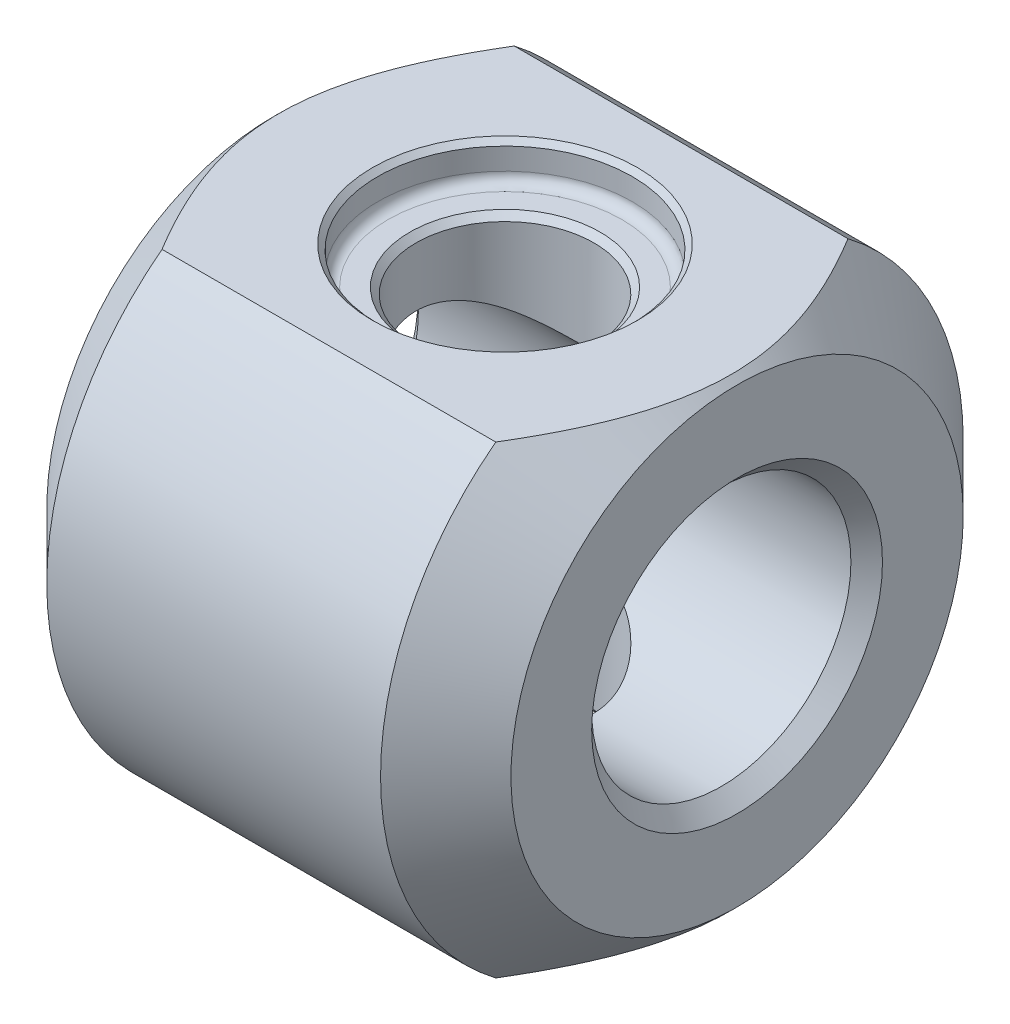
ISO-10303-21;
HEADER;
FILE_DESCRIPTION(('STEP AP214'),'2;1');
FILE_NAME('part.step','',(''),(''),'','','');
FILE_SCHEMA(('AUTOMOTIVE_DESIGN { 1 0 10303 214 1 1 1 1 }'));
ENDSEC;
DATA;
#1=APPLICATION_CONTEXT('core data for automotive mechanical design processes');
#2=APPLICATION_PROTOCOL_DEFINITION('international standard','automotive_design',2000,#1);
#3=PRODUCT_CONTEXT('',#1,'mechanical');
#4=PRODUCT('Part','Part','',(#3));
#5=PRODUCT_RELATED_PRODUCT_CATEGORY('part','',(#4));
#6=PRODUCT_DEFINITION_FORMATION('','',#4);
#7=PRODUCT_DEFINITION_CONTEXT('part definition',#1,'design');
#8=PRODUCT_DEFINITION('design','',#6,#7);
#9=PRODUCT_DEFINITION_SHAPE('','',#8);
#10=(LENGTH_UNIT() NAMED_UNIT(*) SI_UNIT(.MILLI.,.METRE.));
#11=(NAMED_UNIT(*) PLANE_ANGLE_UNIT() SI_UNIT($,.RADIAN.));
#12=(NAMED_UNIT(*) SI_UNIT($,.STERADIAN.) SOLID_ANGLE_UNIT());
#13=UNCERTAINTY_MEASURE_WITH_UNIT(LENGTH_MEASURE(1.E-05),#10,'distance_accuracy_value','');
#14=(GEOMETRIC_REPRESENTATION_CONTEXT(3) GLOBAL_UNCERTAINTY_ASSIGNED_CONTEXT((#13)) GLOBAL_UNIT_ASSIGNED_CONTEXT((#10,
#11,#12)) REPRESENTATION_CONTEXT('',''));
#15=CARTESIAN_POINT('',(0.,0.,0.));
#16=DIRECTION('',(0.,0.,1.));
#17=DIRECTION('',(1.,0.,0.));
#18=AXIS2_PLACEMENT_3D('',#15,#16,#17);
#19=CARTESIAN_POINT('',(0.,5.03555,0.));
#20=DIRECTION('',(0.,1.,0.));
#21=DIRECTION('',(0.,0.,1.));
#22=AXIS2_PLACEMENT_3D('',#19,#20,#21);
#23=TOROIDAL_SURFACE('',#22,2.8702,0.254);
#24=CARTESIAN_POINT('',(0.,5.03555,0.));
#25=DIRECTION('',(0.,-1.,0.));
#26=DIRECTION('',(0.,0.,1.));
#27=AXIS2_PLACEMENT_3D('',#24,#25,#26);
#28=CIRCLE('',#27,3.1242);
#29=CARTESIAN_POINT('',(0.,5.03555,3.1242));
#30=VERTEX_POINT('',#29);
#31=EDGE_CURVE('E32',#30,#30,#28,.T.);
#32=ORIENTED_EDGE('',*,*,#31,.F.);
#33=EDGE_LOOP('',(#32));
#34=FACE_BOUND('',#33,.T.);
#35=CARTESIAN_POINT('',(0.,4.78155,0.));
#36=DIRECTION('',(0.,1.,0.));
#37=DIRECTION('',(0.,0.,1.));
#38=AXIS2_PLACEMENT_3D('',#35,#36,#37);
#39=CIRCLE('',#38,2.8702);
#40=CARTESIAN_POINT('',(0.,4.78155,2.8702));
#41=VERTEX_POINT('',#40);
#42=EDGE_CURVE('E146',#41,#41,#39,.T.);
#43=ORIENTED_EDGE('',*,*,#42,.F.);
#44=EDGE_LOOP('',(#43));
#45=FACE_BOUND('',#44,.T.);
#46=ADVANCED_FACE('F17',(#34,#45),#23,.F.);
#47=CARTESIAN_POINT('',(0.,5.69595,0.));
#48=DIRECTION('',(0.,1.,0.));
#49=DIRECTION('',(0.,0.,1.));
#50=AXIS2_PLACEMENT_3D('',#47,#48,#49);
#51=CONICAL_SURFACE('',#50,3.2512,0.785398163397443);
#52=CARTESIAN_POINT('',(0.,5.69595,0.));
#53=DIRECTION('',(0.,-1.,0.));
#54=DIRECTION('',(0.,0.,-1.));
#55=AXIS2_PLACEMENT_3D('',#52,#53,#54);
#56=CIRCLE('',#55,3.2512);
#57=CARTESIAN_POINT('',(0.,5.69595,-3.2512));
#58=VERTEX_POINT('',#57);
#59=EDGE_CURVE('E129',#58,#58,#56,.T.);
#60=ORIENTED_EDGE('',*,*,#59,.F.);
#61=EDGE_LOOP('',(#60));
#62=FACE_BOUND('',#61,.T.);
#63=CARTESIAN_POINT('',(0.,5.56894999999999,0.));
#64=DIRECTION('',(0.,-1.,0.));
#65=DIRECTION('',(0.,0.,1.));
#66=AXIS2_PLACEMENT_3D('',#63,#64,#65);
#67=CIRCLE('',#66,3.1242);
#68=CARTESIAN_POINT('',(0.,5.56894999999999,3.1242));
#69=VERTEX_POINT('',#68);
#70=EDGE_CURVE('E11',#69,#69,#67,.T.);
#71=ORIENTED_EDGE('',*,*,#70,.T.);
#72=EDGE_LOOP('',(#71));
#73=FACE_BOUND('',#72,.T.);
#74=ADVANCED_FACE('F210',(#62,#73),#51,.F.);
#75=CARTESIAN_POINT('',(0.,4.78155,0.));
#76=DIRECTION('',(0.,1.,0.));
#77=DIRECTION('',(0.,0.,1.));
#78=AXIS2_PLACEMENT_3D('',#75,#76,#77);
#79=CYLINDRICAL_SURFACE('',#78,3.1242);
#80=ORIENTED_EDGE('',*,*,#70,.F.);
#81=EDGE_LOOP('',(#80));
#82=FACE_BOUND('',#81,.T.);
#83=ORIENTED_EDGE('',*,*,#31,.T.);
#84=EDGE_LOOP('',(#83));
#85=FACE_BOUND('',#84,.T.);
#86=ADVANCED_FACE('F216',(#82,#85),#79,.F.);
#87=CARTESIAN_POINT('',(0.,5.69595,0.));
#88=DIRECTION('',(0.,1.,0.));
#89=DIRECTION('',(0.,0.,1.));
#90=AXIS2_PLACEMENT_3D('',#87,#88,#89);
#91=CONICAL_SURFACE('',#90,3.2512,0.785398163397443);
#92=CARTESIAN_POINT('',(0.,4.78155,0.));
#93=DIRECTION('',(0.,-1.,0.));
#94=DIRECTION('',(0.,0.,1.));
#95=AXIS2_PLACEMENT_3D('',#92,#93,#94);
#96=CIRCLE('',#95,2.33680000000001);
#97=CARTESIAN_POINT('',(0.,4.78155,2.33680000000001));
#98=VERTEX_POINT('',#97);
#99=EDGE_CURVE('E143',#98,#98,#96,.T.);
#100=ORIENTED_EDGE('',*,*,#99,.F.);
#101=EDGE_LOOP('',(#100));
#102=FACE_BOUND('',#101,.T.);
#103=CARTESIAN_POINT('',(0.,4.62914999999998,0.));
#104=DIRECTION('',(0.,-1.,0.));
#105=DIRECTION('',(0.,0.,1.));
#106=AXIS2_PLACEMENT_3D('',#103,#104,#105);
#107=CIRCLE('',#106,2.1844);
#108=CARTESIAN_POINT('',(0.,4.62914999999998,2.1844));
#109=VERTEX_POINT('',#108);
#110=EDGE_CURVE('E139',#109,#109,#107,.T.);
#111=ORIENTED_EDGE('',*,*,#110,.T.);
#112=EDGE_LOOP('',(#111));
#113=FACE_BOUND('',#112,.T.);
#114=ADVANCED_FACE('F186',(#102,#113),#91,.F.);
#115=CARTESIAN_POINT('',(0.,-5.69594999999999,0.));
#116=DIRECTION('',(0.,1.,0.));
#117=DIRECTION('',(0.,0.,1.));
#118=AXIS2_PLACEMENT_3D('',#115,#116,#117);
#119=CYLINDRICAL_SURFACE('',#118,2.1844);
#120=CARTESIAN_POINT('',(0.,-2.31287363738273,2.1844));
#121=CARTESIAN_POINT('',(-0.052775967058871,-2.31287365629959,2.18439999055885));
#122=CARTESIAN_POINT('',(-0.105551679292286,-2.31469003915871,2.18248220806963));
#123=CARTESIAN_POINT('',(-0.21059782186241,-2.32184836305011,2.17486365138228));
#124=CARTESIAN_POINT('',(-0.262867995128523,-2.32719201098424,2.16916104563834));
#125=CARTESIAN_POINT('',(-0.418391793972082,-2.34817533952594,2.14651043328606));
#126=CARTESIAN_POINT('',(-0.520232193842515,-2.36876645312802,2.12402003984469));
#127=CARTESIAN_POINT('',(-0.716219128547651,-2.41938042727011,2.06615915045149));
#128=CARTESIAN_POINT('',(-0.810436048415073,-2.4493005107077,2.03092836971318));
#129=CARTESIAN_POINT('',(-0.991448662153189,-2.5150047136825,1.94897425842462));
#130=CARTESIAN_POINT('',(-1.07824391561425,-2.55078918085154,1.90225024649063));
#131=CARTESIAN_POINT('',(-1.25780916287401,-2.63134587231147,1.78957029246525));
#132=CARTESIAN_POINT('',(-1.3491548698521,-2.67662087403536,1.72170547805001));
#133=CARTESIAN_POINT('',(-1.52042594869233,-2.76691032836925,1.57251967772811));
#134=CARTESIAN_POINT('',(-1.60033784453975,-2.81192441450067,1.49118305336857));
#135=CARTESIAN_POINT('',(-1.75899609265911,-2.90494304992426,1.30195363619092));
#136=CARTESIAN_POINT('',(-1.83557645539304,-2.95230192317537,1.19189589985979));
#137=CARTESIAN_POINT('',(-1.96840891354542,-3.03667482710153,0.956617329068121));
#138=CARTESIAN_POINT('',(-2.02469976805888,-3.07370855093541,0.831426022129673));
#139=CARTESIAN_POINT('',(-2.10179588069925,-3.12511557702248,0.603750732578744));
#140=CARTESIAN_POINT('',(-2.12802648268155,-3.14287948837364,0.503855708779994));
#141=CARTESIAN_POINT('',(-2.16615057707063,-3.16881556762272,0.300169700051877));
#142=CARTESIAN_POINT('',(-2.17805528578767,-3.17699523926996,0.196381828728766));
#143=CARTESIAN_POINT('',(-2.18686560323184,-3.1830418847105,-0.0123190316314128));
#144=CARTESIAN_POINT('',(-2.18374450523154,-3.18089049619195,-0.117233693059695));
#145=CARTESIAN_POINT('',(-2.16263077086231,-3.16643302572761,-0.324847072167807));
#146=CARTESIAN_POINT('',(-2.14463377080659,-3.15412396413879,-0.427545130559352));
#147=CARTESIAN_POINT('',(-2.0952580848353,-3.12076412751341,-0.625894136866428));
#148=CARTESIAN_POINT('',(-2.06415348218849,-3.09989261974433,-0.72164479130178));
#149=CARTESIAN_POINT('',(-1.98996948771394,-3.05099763333762,-0.906390954286367));
#150=CARTESIAN_POINT('',(-1.94688794265187,-3.02297286875,-0.99538524449936));
#151=CARTESIAN_POINT('',(-1.84469545063908,-2.95813266912853,-1.17496752999118));
#152=CARTESIAN_POINT('',(-1.78432568489673,-2.92068267343483,-1.26460626386947));
#153=CARTESIAN_POINT('',(-1.65208611063199,-2.84182232681261,-1.4330756022748));
#154=CARTESIAN_POINT('',(-1.58020308746522,-2.80040744732643,-1.51189359158615));
#155=CARTESIAN_POINT('',(-1.41282223556564,-2.70918459272666,-1.67064526254107));
#156=CARTESIAN_POINT('',(-1.31538996183768,-2.65916185113314,-1.74842301809686));
#157=CARTESIAN_POINT('',(-1.10745239451894,-2.56268676088869,-1.88699282735712));
#158=CARTESIAN_POINT('',(-0.996951984459897,-2.51623308912338,-1.94779119784579));
#159=CARTESIAN_POINT('',(-0.792568780218977,-2.44352498975675,-2.03780843153947));
#160=CARTESIAN_POINT('',(-0.701259497011111,-2.41511095526958,-2.07111541878479));
#161=CARTESIAN_POINT('',(-0.512938882257727,-2.36733769218634,-2.1255661384347));
#162=CARTESIAN_POINT('',(-0.415945778131813,-2.3479511295312,-2.14674663364218));
#163=CARTESIAN_POINT('',(-0.265037557048195,-2.32743046022237,-2.16890643945947));
#164=CARTESIAN_POINT('',(-0.212363836793794,-2.32200018570739,-2.17470187659168));
#165=CARTESIAN_POINT('',(-0.106460076509808,-2.31472134370323,-2.18244911345779));
#166=CARTESIAN_POINT('',(-0.0532299086409208,-2.31287361830315,-2.18440000952235));
#167=CARTESIAN_POINT('',(0.0527759670588719,-2.31287365629959,-2.18439999055885));
#168=CARTESIAN_POINT('',(0.105551679292287,-2.31469003915871,-2.18248220806963));
#169=CARTESIAN_POINT('',(0.210597821862411,-2.32184836305011,-2.17486365138228));
#170=CARTESIAN_POINT('',(0.262867995128525,-2.32719201098424,-2.16916104563834));
#171=CARTESIAN_POINT('',(0.418391793972083,-2.34817533952594,-2.14651043328606));
#172=CARTESIAN_POINT('',(0.520232193842516,-2.36876645312802,-2.12402003984469));
#173=CARTESIAN_POINT('',(0.716219128547652,-2.41938042727011,-2.06615915045149));
#174=CARTESIAN_POINT('',(0.810436048415073,-2.4493005107077,-2.03092836971318));
#175=CARTESIAN_POINT('',(0.991448662153189,-2.5150047136825,-1.94897425842462));
#176=CARTESIAN_POINT('',(1.07824391561425,-2.55078918085154,-1.90225024649063));
#177=CARTESIAN_POINT('',(1.25780916287401,-2.63134587231147,-1.78957029246525));
#178=CARTESIAN_POINT('',(1.34915486985211,-2.67662087403536,-1.72170547805001));
#179=CARTESIAN_POINT('',(1.52042594869233,-2.76691032836925,-1.57251967772811));
#180=CARTESIAN_POINT('',(1.60033784453975,-2.81192441450067,-1.49118305336857));
#181=CARTESIAN_POINT('',(1.75899609265911,-2.90494304992426,-1.30195363619092));
#182=CARTESIAN_POINT('',(1.83557645539304,-2.95230192317537,-1.19189589985979));
#183=CARTESIAN_POINT('',(1.96840891354542,-3.03667482710153,-0.956617329068119));
#184=CARTESIAN_POINT('',(2.02469976805888,-3.07370855093541,-0.831426022129672));
#185=CARTESIAN_POINT('',(2.10179588069925,-3.12511557702248,-0.603750732578743));
#186=CARTESIAN_POINT('',(2.12802648268155,-3.14287948837364,-0.503855708779993));
#187=CARTESIAN_POINT('',(2.16615057707063,-3.16881556762272,-0.300169700051876));
#188=CARTESIAN_POINT('',(2.17805528578767,-3.17699523926996,-0.196381828728765));
#189=CARTESIAN_POINT('',(2.18686560323184,-3.1830418847105,0.0123190316314141));
#190=CARTESIAN_POINT('',(2.18374450523154,-3.18089049619195,0.117233693059697));
#191=CARTESIAN_POINT('',(2.16263077086231,-3.16643302572761,0.324847072167808));
#192=CARTESIAN_POINT('',(2.14463377080659,-3.15412396413879,0.427545130559354));
#193=CARTESIAN_POINT('',(2.0952580848353,-3.12076412751341,0.62589413686643));
#194=CARTESIAN_POINT('',(2.06415348218849,-3.09989261974433,0.721644791301782));
#195=CARTESIAN_POINT('',(1.98996948771394,-3.05099763333762,0.906390954286368));
#196=CARTESIAN_POINT('',(1.94688794265186,-3.02297286874999,0.995385244499361));
#197=CARTESIAN_POINT('',(1.84469545063908,-2.95813266912853,1.17496752999118));
#198=CARTESIAN_POINT('',(1.78432568489673,-2.92068267343483,1.26460626386948));
#199=CARTESIAN_POINT('',(1.65208611063199,-2.84182232681261,1.4330756022748));
#200=CARTESIAN_POINT('',(1.58020308746522,-2.80040744732643,1.51189359158615));
#201=CARTESIAN_POINT('',(1.41282223556564,-2.70918459272666,1.67064526254107));
#202=CARTESIAN_POINT('',(1.31538996183768,-2.65916185113313,1.74842301809686));
#203=CARTESIAN_POINT('',(1.10745239451894,-2.56268676088869,1.88699282735712));
#204=CARTESIAN_POINT('',(0.996951984459896,-2.51623308912338,1.94779119784579));
#205=CARTESIAN_POINT('',(0.792568780218975,-2.44352498975675,2.03780843153947));
#206=CARTESIAN_POINT('',(0.70125949701111,-2.41511095526958,2.07111541878479));
#207=CARTESIAN_POINT('',(0.512938882257726,-2.36733769218634,2.1255661384347));
#208=CARTESIAN_POINT('',(0.415945778131812,-2.3479511295312,2.14674663364218));
#209=CARTESIAN_POINT('',(0.265037557048195,-2.32743046022237,2.16890643945947));
#210=CARTESIAN_POINT('',(0.212363836793794,-2.32200018570739,2.17470187659168));
#211=CARTESIAN_POINT('',(0.106460076509808,-2.31472134370323,2.18244911345779));
#212=CARTESIAN_POINT('',(0.0532299086409213,-2.31287361830315,2.18440000952235));
#213=CARTESIAN_POINT('',(0.,-2.31287363738273,2.1844));
#214=B_SPLINE_CURVE_WITH_KNOTS('',3,(#120,#121,#122,#123,#124,#125,#126,#127,#128,#129,#130,
#131,#132,#133,#134,#135,#136,#137,#138,#139,#140,#141,#142,#143,#144,#145,#146,#147,#148,#149,
#150,#151,#152,#153,#154,#155,#156,#157,#158,#159,#160,#161,#162,#163,#164,#165,#166,#167,#168,
#169,#170,#171,#172,#173,#174,#175,#176,#177,#178,#179,#180,#181,#182,#183,#184,#185,#186,#187,
#188,#189,#190,#191,#192,#193,#194,#195,#196,#197,#198,#199,#200,#201,#202,#203,#204,#205,#206,
#207,#208,#209,#210,#211,#212,#213),.UNSPECIFIED.,.T.,.F.,(4,2,2,2,2,2,2,2,2,2,2,2,2,2,2,2,2,2,
2,2,2,2,2,2,2,2,2,2,2,2,2,2,2,2,2,2,2,2,2,2,2,2,2,2,2,2,4),(0.,0.158257697242758,
0.316592034198541,0.633633845546447,0.947299370325168,1.26098349545364,1.62707243202141,
1.99358935215415,2.41783410604652,2.84126407437208,3.1543039108888,3.46709849630289,
3.78044924491102,4.09389194424417,4.40108244464796,4.70832820801749,5.05017609503185,
5.39241919639615,5.79373931702056,6.19490993635984,6.49766517015104,6.79949764056377,
6.959079053155,7.11869797129927,7.27695566854203,7.43529000549781,7.75233181684572,
8.06599734162444,8.37968146675291,8.74577040332068,9.11228732345342,9.53653207734579,
9.95996204567136,10.2730018821881,10.5857964676022,10.8991472162103,11.2125899155434,
11.5197804159472,11.8270261793168,12.1688740663311,12.5111171676954,12.9124372883198,
13.3136079076591,13.6163631414503,13.918195611863,14.0777770244543,14.2373959425985),.UNSPECIFIED.);
#215=CARTESIAN_POINT('',(0.,-2.31287363738273,2.1844));
#216=VERTEX_POINT('',#215);
#217=EDGE_CURVE('E161',#216,#216,#214,.T.);
#218=ORIENTED_EDGE('',*,*,#217,.F.);
#219=EDGE_LOOP('',(#218));
#220=FACE_BOUND('',#219,.T.);
#221=CARTESIAN_POINT('',(0.,-5.30225,0.));
#222=DIRECTION('',(0.,1.,0.));
#223=DIRECTION('',(0.,0.,-1.));
#224=AXIS2_PLACEMENT_3D('',#221,#222,#223);
#225=CIRCLE('',#224,2.1844);
#226=CARTESIAN_POINT('',(0.,-5.30225,-2.1844));
#227=VERTEX_POINT('',#226);
#228=EDGE_CURVE('E142',#227,#227,#225,.T.);
#229=ORIENTED_EDGE('',*,*,#228,.F.);
#230=EDGE_LOOP('',(#229));
#231=FACE_BOUND('',#230,.T.);
#232=ADVANCED_FACE('F180',(#220,#231),#119,.F.);
#233=CARTESIAN_POINT('',(0.,-5.69594999999999,0.));
#234=DIRECTION('',(0.,-1.,0.));
#235=DIRECTION('',(0.,0.,-1.));
#236=AXIS2_PLACEMENT_3D('',#233,#234,#235);
#237=CONICAL_SURFACE('',#236,2.5781,0.785398163397454);
#238=CARTESIAN_POINT('',(0.,-5.69594999999999,0.));
#239=DIRECTION('',(0.,-1.,0.));
#240=DIRECTION('',(0.,0.,-1.));
#241=AXIS2_PLACEMENT_3D('',#238,#239,#240);
#242=CIRCLE('',#241,2.5781);
#243=CARTESIAN_POINT('',(0.,-5.69594999999999,-2.5781));
#244=VERTEX_POINT('',#243);
#245=EDGE_CURVE('E149',#244,#244,#242,.T.);
#246=ORIENTED_EDGE('',*,*,#245,.T.);
#247=EDGE_LOOP('',(#246));
#248=FACE_BOUND('',#247,.T.);
#249=ORIENTED_EDGE('',*,*,#228,.T.);
#250=EDGE_LOOP('',(#249));
#251=FACE_BOUND('',#250,.T.);
#252=ADVANCED_FACE('F185',(#248,#251),#237,.F.);
#253=CARTESIAN_POINT('',(-5.69595,0.,0.));
#254=DIRECTION('',(-1.,0.,0.));
#255=DIRECTION('',(0.,0.,-1.));
#256=AXIS2_PLACEMENT_3D('',#253,#254,#255);
#257=CONICAL_SURFACE('',#256,3.5687,0.785398163397444);
#258=CARTESIAN_POINT('',(-5.69595,0.,0.));
#259=DIRECTION('',(-1.,0.,0.));
#260=DIRECTION('',(0.,0.,1.));
#261=AXIS2_PLACEMENT_3D('',#258,#259,#260);
#262=CIRCLE('',#261,3.5687);
#263=CARTESIAN_POINT('',(-5.69595,0.,3.5687));
#264=VERTEX_POINT('',#263);
#265=EDGE_CURVE('E155',#264,#264,#262,.T.);
#266=ORIENTED_EDGE('',*,*,#265,.T.);
#267=EDGE_LOOP('',(#266));
#268=FACE_BOUND('',#267,.T.);
#269=CARTESIAN_POINT('',(-5.3086,0.,0.));
#270=DIRECTION('',(1.,0.,0.));
#271=DIRECTION('',(0.,0.,1.));
#272=AXIS2_PLACEMENT_3D('',#269,#270,#271);
#273=CIRCLE('',#272,3.18135);
#274=CARTESIAN_POINT('',(-5.3086,0.,3.18135));
#275=VERTEX_POINT('',#274);
#276=EDGE_CURVE('E152',#275,#275,#273,.T.);
#277=ORIENTED_EDGE('',*,*,#276,.T.);
#278=EDGE_LOOP('',(#277));
#279=FACE_BOUND('',#278,.T.);
#280=ADVANCED_FACE('F191',(#268,#279),#257,.F.);
#281=CARTESIAN_POINT('',(5.69595,0.,0.));
#282=DIRECTION('',(1.,0.,0.));
#283=DIRECTION('',(0.,0.,-1.));
#284=AXIS2_PLACEMENT_3D('',#281,#282,#283);
#285=CONICAL_SURFACE('',#284,3.5687,0.785398163397444);
#286=CARTESIAN_POINT('',(5.69595,0.,0.));
#287=DIRECTION('',(-1.,0.,0.));
#288=DIRECTION('',(0.,0.,1.));
#289=AXIS2_PLACEMENT_3D('',#286,#287,#288);
#290=CIRCLE('',#289,3.5687);
#291=CARTESIAN_POINT('',(5.69595,0.,3.5687));
#292=VERTEX_POINT('',#291);
#293=EDGE_CURVE('E92',#292,#292,#290,.T.);
#294=ORIENTED_EDGE('',*,*,#293,.F.);
#295=EDGE_LOOP('',(#294));
#296=FACE_BOUND('',#295,.T.);
#297=CARTESIAN_POINT('',(5.3086,0.,0.));
#298=DIRECTION('',(-1.,0.,0.));
#299=DIRECTION('',(0.,0.,-1.));
#300=AXIS2_PLACEMENT_3D('',#297,#298,#299);
#301=CIRCLE('',#300,3.18135);
#302=CARTESIAN_POINT('',(5.3086,0.,-3.18135));
#303=VERTEX_POINT('',#302);
#304=EDGE_CURVE('E158',#303,#303,#301,.T.);
#305=ORIENTED_EDGE('',*,*,#304,.T.);
#306=EDGE_LOOP('',(#305));
#307=FACE_BOUND('',#306,.T.);
#308=ADVANCED_FACE('F195',(#296,#307),#285,.F.);
#309=CARTESIAN_POINT('',(5.69595,0.,0.));
#310=DIRECTION('',(-1.,0.,0.));
#311=DIRECTION('',(0.,0.,1.));
#312=AXIS2_PLACEMENT_3D('',#309,#310,#311);
#313=CONICAL_SURFACE('',#312,5.5499,0.785398163397447);
#314=CARTESIAN_POINT('',(4.09575,0.,0.));
#315=DIRECTION('',(-1.,0.,0.));
#316=DIRECTION('',(0.,0.,-1.));
#317=AXIS2_PLACEMENT_3D('',#314,#315,#316);
#318=CIRCLE('',#317,7.1501);
#319=CARTESIAN_POINT('',(4.09575,-5.69594999999999,4.32204622921828));
#320=VERTEX_POINT('',#319);
#321=CARTESIAN_POINT('',(4.09575,5.69594999999999,4.32204622921828));
#322=VERTEX_POINT('',#321);
#323=EDGE_CURVE('E172',#320,#322,#318,.T.);
#324=ORIENTED_EDGE('',*,*,#323,.F.);
#325=CARTESIAN_POINT('',(4.09575,-5.69594999999999,4.32204622921828));
#326=CARTESIAN_POINT('',(4.15926603013375,-5.69594999999999,4.21695846305226));
#327=CARTESIAN_POINT('',(4.22171520284527,-5.69594999999999,4.11122689212942));
#328=CARTESIAN_POINT('',(4.34416977775197,-5.69594999999999,3.89832605142548));
#329=CARTESIAN_POINT('',(4.40417459612599,-5.69594999999999,3.79115644620916));
#330=CARTESIAN_POINT('',(4.58045099443794,-5.69594999999999,3.46653330711349));
#331=CARTESIAN_POINT('',(4.69250439645086,-5.69594999999999,3.24674972572495));
#332=CARTESIAN_POINT('',(4.90385437953101,-5.69594999999999,2.79596933896802));
#333=CARTESIAN_POINT('',(5.00286939308884,-5.69594999999999,2.56483903799866));
#334=CARTESIAN_POINT('',(5.18067433107979,-5.69594999999999,2.09513154147903));
#335=CARTESIAN_POINT('',(5.25949490929005,-5.69594999999999,1.85656625665559));
#336=CARTESIAN_POINT('',(5.37078125131841,-5.69594999999999,1.44848176915511));
#337=CARTESIAN_POINT('',(5.41003057643964,-5.69594999999999,1.28081537300706));
#338=CARTESIAN_POINT('',(5.47478140803182,-5.69594999999999,0.942799655804567));
#339=CARTESIAN_POINT('',(5.5002827876725,-5.69594999999999,0.772450310013757));
#340=CARTESIAN_POINT('',(5.53605200126225,-5.69594999999999,0.431712957832102));
#341=CARTESIAN_POINT('',(5.54645698221521,-5.69594999999999,0.261339544847954));
#342=CARTESIAN_POINT('',(5.55189421084078,-5.69594999999999,-0.0796490747855936));
#343=CARTESIAN_POINT('',(5.54692708017821,-5.69594999999999,-0.250264271378088));
#344=CARTESIAN_POINT('',(5.5219168141074,-5.69594999999999,-0.590126141447942));
#345=CARTESIAN_POINT('',(5.50189542723299,-5.69594999999999,-0.759374433483599));
#346=CARTESIAN_POINT('',(5.44786946479093,-5.69594999999999,-1.09558660044263));
#347=CARTESIAN_POINT('',(5.41386337574004,-5.69594999999999,-1.26255022608834));
#348=CARTESIAN_POINT('',(5.29248992037975,-5.69594999999999,-1.76160226269807));
#349=CARTESIAN_POINT('',(5.18600958026149,-5.69594999999999,-2.08911827160669));
#350=CARTESIAN_POINT('',(4.99592492728821,-5.69594999999999,-2.57717241684266));
#351=CARTESIAN_POINT('',(4.92544423493976,-5.69594999999999,-2.74319347706026));
#352=CARTESIAN_POINT('',(4.77616222621409,-5.69594999999999,-3.07153842616162));
#353=CARTESIAN_POINT('',(4.69735891730803,-5.69594999999999,-3.23386141832609));
#354=CARTESIAN_POINT('',(4.5343672491538,-5.69594999999999,-3.55226590725866));
#355=CARTESIAN_POINT('',(4.45029303499405,-5.69594999999999,-3.70840658235204));
#356=CARTESIAN_POINT('',(4.27678089008303,-5.69594999999999,-4.01749438302566));
#357=CARTESIAN_POINT('',(4.18734804830148,-5.69594999999999,-4.17044435828016));
#358=CARTESIAN_POINT('',(4.09575,-5.69594999999999,-4.32204622921828));
#359=B_SPLINE_CURVE_WITH_KNOTS('',3,(#325,#326,#327,#328,#329,#330,#331,#332,#333,#334,#335,
#336,#337,#338,#339,#340,#341,#342,#343,#344,#345,#346,#347,#348,#349,#350,#351,#352,#353,#354,
#355,#356,#357,#358),.UNSPECIFIED.,.F.,.F.,(4,2,2,2,2,2,2,2,2,2,2,2,2,2,2,2,4),(0.,
0.36836176159817,0.736810994690955,1.47646527369619,2.2301180371791,2.9826199372487,
3.49872734748742,4.01483951894133,4.52623293030552,5.0376056606371,5.54824103871303,
6.0589316944448,7.08845466935974,7.62941341754687,8.17050197225206,8.70240376073897,
9.23380818300558),.UNSPECIFIED.);
#360=CARTESIAN_POINT('',(4.09575,-5.69594999999999,-4.32204622921828));
#361=VERTEX_POINT('',#360);
#362=EDGE_CURVE('E89',#320,#361,#359,.T.);
#363=ORIENTED_EDGE('',*,*,#362,.T.);
#364=CARTESIAN_POINT('',(4.09575,0.,0.));
#365=DIRECTION('',(-1.,0.,0.));
#366=DIRECTION('',(0.,0.,-1.));
#367=AXIS2_PLACEMENT_3D('',#364,#365,#366);
#368=CIRCLE('',#367,7.1501);
#369=CARTESIAN_POINT('',(4.09575,5.69594999999999,-4.32204622921828));
#370=VERTEX_POINT('',#369);
#371=EDGE_CURVE('E80',#370,#361,#368,.T.);
#372=ORIENTED_EDGE('',*,*,#371,.F.);
#373=CARTESIAN_POINT('',(4.09575,5.69594999999999,4.32204622921828));
#374=CARTESIAN_POINT('',(4.15926603013375,5.69594999999999,4.21695846305226));
#375=CARTESIAN_POINT('',(4.22171520284527,5.69594999999999,4.11122689212942));
#376=CARTESIAN_POINT('',(4.34416977775197,5.69594999999999,3.89832605142548));
#377=CARTESIAN_POINT('',(4.40417459612599,5.69594999999999,3.79115644620916));
#378=CARTESIAN_POINT('',(4.58045099443794,5.69594999999999,3.46653330711349));
#379=CARTESIAN_POINT('',(4.69250439645086,5.69594999999999,3.24674972572495));
#380=CARTESIAN_POINT('',(4.90385437953101,5.69594999999999,2.79596933896802));
#381=CARTESIAN_POINT('',(5.00286939308884,5.69594999999999,2.56483903799866));
#382=CARTESIAN_POINT('',(5.18067433107979,5.69594999999999,2.09513154147903));
#383=CARTESIAN_POINT('',(5.25949490929005,5.69594999999999,1.85656625665559));
#384=CARTESIAN_POINT('',(5.37078125131841,5.69594999999999,1.44848176915511));
#385=CARTESIAN_POINT('',(5.41003057643964,5.69594999999999,1.28081537300706));
#386=CARTESIAN_POINT('',(5.47478140803182,5.69594999999999,0.942799655804567));
#387=CARTESIAN_POINT('',(5.5002827876725,5.69594999999999,0.772450310013757));
#388=CARTESIAN_POINT('',(5.53605200126225,5.69594999999999,0.431712957832102));
#389=CARTESIAN_POINT('',(5.54645698221521,5.69594999999999,0.261339544847954));
#390=CARTESIAN_POINT('',(5.55189421084078,5.69594999999999,-0.0796490747855936));
#391=CARTESIAN_POINT('',(5.54692708017821,5.69594999999999,-0.250264271378088));
#392=CARTESIAN_POINT('',(5.5219168141074,5.69594999999999,-0.590126141447942));
#393=CARTESIAN_POINT('',(5.50189542723299,5.69594999999999,-0.759374433483599));
#394=CARTESIAN_POINT('',(5.44786946479093,5.69594999999999,-1.09558660044263));
#395=CARTESIAN_POINT('',(5.41386337574004,5.69594999999999,-1.26255022608834));
#396=CARTESIAN_POINT('',(5.29248992037975,5.69594999999999,-1.76160226269807));
#397=CARTESIAN_POINT('',(5.18600958026149,5.69594999999999,-2.08911827160669));
#398=CARTESIAN_POINT('',(4.99592492728821,5.69594999999999,-2.57717241684266));
#399=CARTESIAN_POINT('',(4.92544423493976,5.69594999999999,-2.74319347706026));
#400=CARTESIAN_POINT('',(4.77616222621409,5.69594999999999,-3.07153842616162));
#401=CARTESIAN_POINT('',(4.69735891730803,5.69594999999999,-3.23386141832609));
#402=CARTESIAN_POINT('',(4.5343672491538,5.69594999999999,-3.55226590725866));
#403=CARTESIAN_POINT('',(4.45029303499405,5.69594999999999,-3.70840658235204));
#404=CARTESIAN_POINT('',(4.27678089008303,5.69594999999999,-4.01749438302566));
#405=CARTESIAN_POINT('',(4.18734804830148,5.69594999999999,-4.17044435828016));
#406=CARTESIAN_POINT('',(4.09575,5.69594999999999,-4.32204622921828));
#407=B_SPLINE_CURVE_WITH_KNOTS('',3,(#373,#374,#375,#376,#377,#378,#379,#380,#381,#382,#383,
#384,#385,#386,#387,#388,#389,#390,#391,#392,#393,#394,#395,#396,#397,#398,#399,#400,#401,#402,
#403,#404,#405,#406),.UNSPECIFIED.,.F.,.F.,(4,2,2,2,2,2,2,2,2,2,2,2,2,2,2,2,4),(0.,
0.36836176159817,0.736810994690955,1.47646527369619,2.2301180371791,2.9826199372487,
3.49872734748742,4.01483951894133,4.52623293030552,5.0376056606371,5.54824103871303,
6.0589316944448,7.08845466935974,7.62941341754687,8.17050197225206,8.70240376073897,
9.23380818300558),.UNSPECIFIED.);
#408=EDGE_CURVE('E21',#322,#370,#407,.T.);
#409=ORIENTED_EDGE('',*,*,#408,.F.);
#410=EDGE_LOOP('',(#324,#363,#372,#409));
#411=FACE_BOUND('',#410,.T.);
#412=CARTESIAN_POINT('',(5.69595,0.,0.));
#413=DIRECTION('',(1.,0.,0.));
#414=DIRECTION('',(0.,0.,-1.));
#415=AXIS2_PLACEMENT_3D('',#412,#413,#414);
#416=CIRCLE('',#415,5.5499);
#417=CARTESIAN_POINT('',(5.69595,0.,-5.5499));
#418=VERTEX_POINT('',#417);
#419=EDGE_CURVE('E135',#418,#418,#416,.T.);
#420=ORIENTED_EDGE('',*,*,#419,.F.);
#421=EDGE_LOOP('',(#420));
#422=FACE_BOUND('',#421,.T.);
#423=ADVANCED_FACE('F198',(#411,#422),#313,.T.);
#424=CARTESIAN_POINT('',(-4.09575,0.,0.));
#425=DIRECTION('',(1.,0.,0.));
#426=DIRECTION('',(0.,0.,-1.));
#427=AXIS2_PLACEMENT_3D('',#424,#425,#426);
#428=CONICAL_SURFACE('',#427,7.1501,0.785398163397449);
#429=CARTESIAN_POINT('',(-4.09575,0.,0.));
#430=DIRECTION('',(1.,0.,0.));
#431=DIRECTION('',(0.,0.,-1.));
#432=AXIS2_PLACEMENT_3D('',#429,#430,#431);
#433=CIRCLE('',#432,7.1501);
#434=CARTESIAN_POINT('',(-4.09575,-5.69594999999999,-4.32204622921828));
#435=VERTEX_POINT('',#434);
#436=CARTESIAN_POINT('',(-4.09575,5.69594999999999,-4.32204622921828));
#437=VERTEX_POINT('',#436);
#438=EDGE_CURVE('E64',#435,#437,#433,.T.);
#439=ORIENTED_EDGE('',*,*,#438,.F.);
#440=CARTESIAN_POINT('',(-4.09575000000001,-5.69594999999999,-4.32204622921828));
#441=CARTESIAN_POINT('',(-4.15926603013375,-5.69594999999999,-4.21695846305226));
#442=CARTESIAN_POINT('',(-4.22171520284527,-5.69594999999999,-4.11122689212942));
#443=CARTESIAN_POINT('',(-4.34416977775198,-5.69594999999999,-3.89832605142548));
#444=CARTESIAN_POINT('',(-4.40417459612599,-5.69594999999999,-3.79115644620916));
#445=CARTESIAN_POINT('',(-4.58045099443795,-5.69594999999999,-3.46653330711349));
#446=CARTESIAN_POINT('',(-4.69250439645087,-5.69594999999999,-3.24674972572495));
#447=CARTESIAN_POINT('',(-4.90385437953101,-5.69594999999999,-2.79596933896802));
#448=CARTESIAN_POINT('',(-5.00286939308884,-5.69594999999999,-2.56483903799866));
#449=CARTESIAN_POINT('',(-5.18067433107979,-5.69594999999999,-2.09513154147902));
#450=CARTESIAN_POINT('',(-5.25949490929005,-5.69594999999999,-1.85656625665558));
#451=CARTESIAN_POINT('',(-5.37078125131841,-5.69594999999999,-1.4484817691551));
#452=CARTESIAN_POINT('',(-5.41003057643964,-5.69594999999999,-1.28081537300705));
#453=CARTESIAN_POINT('',(-5.47478140803182,-5.69594999999999,-0.942799655804554));
#454=CARTESIAN_POINT('',(-5.5002827876725,-5.69594999999999,-0.772450310013743));
#455=CARTESIAN_POINT('',(-5.53605200126225,-5.69594999999999,-0.431712957832087));
#456=CARTESIAN_POINT('',(-5.54645698221521,-5.69594999999999,-0.261339544847937));
#457=CARTESIAN_POINT('',(-5.55189421084078,-5.69594999999999,0.0796490747856116));
#458=CARTESIAN_POINT('',(-5.54692708017821,-5.69594999999999,0.250264271378106));
#459=CARTESIAN_POINT('',(-5.52191681410739,-5.69594999999999,0.590126141447962));
#460=CARTESIAN_POINT('',(-5.50189542723298,-5.69594999999999,0.75937443348362));
#461=CARTESIAN_POINT('',(-5.44786946479092,-5.69594999999999,1.09558660044265));
#462=CARTESIAN_POINT('',(-5.41386337574003,-5.69594999999999,1.26255022608836));
#463=CARTESIAN_POINT('',(-5.29248992037974,-5.69594999999999,1.7616022626981));
#464=CARTESIAN_POINT('',(-5.18600958026148,-5.69594999999999,2.08911827160671));
#465=CARTESIAN_POINT('',(-4.9959249272882,-5.69594999999999,2.57717241684269));
#466=CARTESIAN_POINT('',(-4.92544423493975,-5.69594999999999,2.74319347706028));
#467=CARTESIAN_POINT('',(-4.77616222621408,-5.69594999999999,3.07153842616163));
#468=CARTESIAN_POINT('',(-4.69735891730803,-5.69594999999999,3.2338614183261));
#469=CARTESIAN_POINT('',(-4.5343672491538,-5.69594999999999,3.55226590725867));
#470=CARTESIAN_POINT('',(-4.45029303499405,-5.69594999999999,3.70840658235205));
#471=CARTESIAN_POINT('',(-4.27678089008303,-5.69594999999999,4.01749438302566));
#472=CARTESIAN_POINT('',(-4.18734804830148,-5.69594999999999,4.17044435828016));
#473=CARTESIAN_POINT('',(-4.09575000000001,-5.69594999999999,4.32204622921828));
#474=B_SPLINE_CURVE_WITH_KNOTS('',3,(#440,#441,#442,#443,#444,#445,#446,#447,#448,#449,#450,
#451,#452,#453,#454,#455,#456,#457,#458,#459,#460,#461,#462,#463,#464,#465,#466,#467,#468,#469,
#470,#471,#472,#473),.UNSPECIFIED.,.F.,.F.,(4,2,2,2,2,2,2,2,2,2,2,2,2,2,2,2,4),(0.,
0.36836176159817,0.736810994690957,1.47646527369619,2.23011803717911,2.9826199372487,
3.49872734748743,4.01483951894135,4.52623293030554,5.03760566063712,5.54824103871305,
6.05893169444482,7.08845466935977,7.62941341754689,8.17050197225207,8.70240376073897,
9.23380818300558),.UNSPECIFIED.);
#475=CARTESIAN_POINT('',(-4.09575,-5.69594999999999,4.32204622921828));
#476=VERTEX_POINT('',#475);
#477=EDGE_CURVE('E70',#435,#476,#474,.T.);
#478=ORIENTED_EDGE('',*,*,#477,.T.);
#479=CARTESIAN_POINT('',(-4.09575,0.,0.));
#480=DIRECTION('',(1.,0.,0.));
#481=DIRECTION('',(0.,0.,-1.));
#482=AXIS2_PLACEMENT_3D('',#479,#480,#481);
#483=CIRCLE('',#482,7.1501);
#484=CARTESIAN_POINT('',(-4.09575,5.69594999999999,4.32204622921828));
#485=VERTEX_POINT('',#484);
#486=EDGE_CURVE('E74',#485,#476,#483,.T.);
#487=ORIENTED_EDGE('',*,*,#486,.F.);
#488=CARTESIAN_POINT('',(-4.09575000000001,5.69594999999999,-4.32204622921828));
#489=CARTESIAN_POINT('',(-4.15926603013375,5.69594999999999,-4.21695846305226));
#490=CARTESIAN_POINT('',(-4.22171520284527,5.69594999999999,-4.11122689212942));
#491=CARTESIAN_POINT('',(-4.34416977775198,5.69594999999999,-3.89832605142548));
#492=CARTESIAN_POINT('',(-4.40417459612599,5.69594999999999,-3.79115644620916));
#493=CARTESIAN_POINT('',(-4.58045099443795,5.69594999999999,-3.46653330711349));
#494=CARTESIAN_POINT('',(-4.69250439645087,5.69594999999999,-3.24674972572495));
#495=CARTESIAN_POINT('',(-4.90385437953101,5.69594999999999,-2.79596933896802));
#496=CARTESIAN_POINT('',(-5.00286939308884,5.69594999999999,-2.56483903799866));
#497=CARTESIAN_POINT('',(-5.18067433107979,5.69594999999999,-2.09513154147902));
#498=CARTESIAN_POINT('',(-5.25949490929005,5.69594999999999,-1.85656625665558));
#499=CARTESIAN_POINT('',(-5.37078125131841,5.69594999999999,-1.4484817691551));
#500=CARTESIAN_POINT('',(-5.41003057643964,5.69594999999999,-1.28081537300705));
#501=CARTESIAN_POINT('',(-5.47478140803182,5.69594999999999,-0.942799655804558));
#502=CARTESIAN_POINT('',(-5.5002827876725,5.69594999999999,-0.772450310013747));
#503=CARTESIAN_POINT('',(-5.53605200126225,5.69594999999999,-0.43171295783209));
#504=CARTESIAN_POINT('',(-5.54645698221521,5.69594999999999,-0.261339544847941));
#505=CARTESIAN_POINT('',(-5.55189421084078,5.69594999999999,0.0796490747856083));
#506=CARTESIAN_POINT('',(-5.54692708017821,5.69594999999999,0.250264271378103));
#507=CARTESIAN_POINT('',(-5.52191681410739,5.69594999999999,0.590126141447959));
#508=CARTESIAN_POINT('',(-5.50189542723299,5.69594999999999,0.759374433483617));
#509=CARTESIAN_POINT('',(-5.44786946479092,5.69594999999999,1.09558660044265));
#510=CARTESIAN_POINT('',(-5.41386337574004,5.69594999999999,1.26255022608836));
#511=CARTESIAN_POINT('',(-5.29248992037974,5.69594999999999,1.76160226269809));
#512=CARTESIAN_POINT('',(-5.18600958026148,5.69594999999999,2.08911827160671));
#513=CARTESIAN_POINT('',(-4.9959249272882,5.69594999999999,2.57717241684268));
#514=CARTESIAN_POINT('',(-4.92544423493975,5.69594999999999,2.74319347706028));
#515=CARTESIAN_POINT('',(-4.77616222621408,5.69594999999999,3.07153842616163));
#516=CARTESIAN_POINT('',(-4.69735891730803,5.69594999999999,3.2338614183261));
#517=CARTESIAN_POINT('',(-4.5343672491538,5.69594999999999,3.55226590725867));
#518=CARTESIAN_POINT('',(-4.45029303499405,5.69594999999999,3.70840658235205));
#519=CARTESIAN_POINT('',(-4.27678089008303,5.69594999999999,4.01749438302566));
#520=CARTESIAN_POINT('',(-4.18734804830148,5.69594999999999,4.17044435828016));
#521=CARTESIAN_POINT('',(-4.09575000000001,5.69594999999999,4.32204622921828));
#522=B_SPLINE_CURVE_WITH_KNOTS('',3,(#488,#489,#490,#491,#492,#493,#494,#495,#496,#497,#498,
#499,#500,#501,#502,#503,#504,#505,#506,#507,#508,#509,#510,#511,#512,#513,#514,#515,#516,#517,
#518,#519,#520,#521),.UNSPECIFIED.,.F.,.F.,(4,2,2,2,2,2,2,2,2,2,2,2,2,2,2,2,4),(0.,
0.36836176159817,0.736810994690956,1.47646527369619,2.23011803717911,2.9826199372487,
3.49872734748742,4.01483951894134,4.52623293030553,5.03760566063711,5.54824103871304,
6.05893169444482,7.08845466935976,7.62941341754688,8.17050197225207,8.70240376073897,
9.23380818300557),.UNSPECIFIED.);
#523=EDGE_CURVE('E71',#437,#485,#522,.T.);
#524=ORIENTED_EDGE('',*,*,#523,.F.);
#525=EDGE_LOOP('',(#439,#478,#487,#524));
#526=FACE_BOUND('',#525,.T.);
#527=CARTESIAN_POINT('',(-5.69595,0.,0.));
#528=DIRECTION('',(-1.,0.,0.));
#529=DIRECTION('',(0.,0.,-1.));
#530=AXIS2_PLACEMENT_3D('',#527,#528,#529);
#531=CIRCLE('',#530,5.54989999999999);
#532=CARTESIAN_POINT('',(-5.69595,0.,-5.54989999999999));
#533=VERTEX_POINT('',#532);
#534=EDGE_CURVE('E131',#533,#533,#531,.T.);
#535=ORIENTED_EDGE('',*,*,#534,.F.);
#536=EDGE_LOOP('',(#535));
#537=FACE_BOUND('',#536,.T.);
#538=ADVANCED_FACE('F66',(#526,#537),#428,.T.);
#539=CARTESIAN_POINT('',(5.69595,0.,0.));
#540=DIRECTION('',(-1.,0.,0.));
#541=DIRECTION('',(0.,0.,1.));
#542=AXIS2_PLACEMENT_3D('',#539,#540,#541);
#543=CYLINDRICAL_SURFACE('',#542,7.1501);
#544=DIRECTION('',(-1.,0.,0.));
#545=VECTOR('',#544,1.);
#546=CARTESIAN_POINT('',(5.69595000000001,-5.69594999999999,4.32204622921828));
#547=LINE('',#546,#545);
#548=EDGE_CURVE('E84',#320,#476,#547,.T.);
#549=ORIENTED_EDGE('',*,*,#548,.F.);
#550=ORIENTED_EDGE('',*,*,#323,.T.);
#551=DIRECTION('',(-1.,0.,0.));
#552=VECTOR('',#551,1.);
#553=CARTESIAN_POINT('',(5.69595000000001,5.69594999999999,4.32204622921828));
#554=LINE('',#553,#552);
#555=EDGE_CURVE('E169',#322,#485,#554,.T.);
#556=ORIENTED_EDGE('',*,*,#555,.T.);
#557=ORIENTED_EDGE('',*,*,#486,.T.);
#558=EDGE_LOOP('',(#549,#550,#556,#557));
#559=FACE_BOUND('',#558,.T.);
#560=ADVANCED_FACE('F207',(#559),#543,.T.);
#561=CARTESIAN_POINT('',(-5.69595,0.,0.));
#562=DIRECTION('',(1.,0.,0.));
#563=DIRECTION('',(0.,0.,-1.));
#564=AXIS2_PLACEMENT_3D('',#561,#562,#563);
#565=CYLINDRICAL_SURFACE('',#564,3.18135);
#566=ORIENTED_EDGE('',*,*,#304,.F.);
#567=EDGE_LOOP('',(#566));
#568=FACE_BOUND('',#567,.T.);
#569=ORIENTED_EDGE('',*,*,#217,.T.);
#570=EDGE_LOOP('',(#569));
#571=FACE_BOUND('',#570,.T.);
#572=ORIENTED_EDGE('',*,*,#276,.F.);
#573=EDGE_LOOP('',(#572));
#574=FACE_BOUND('',#573,.T.);
#575=CARTESIAN_POINT('',(0.,2.31287363738273,-2.1844));
#576=CARTESIAN_POINT('',(-0.0527759670588712,2.31287365629959,-2.18439999055885));
#577=CARTESIAN_POINT('',(-0.105551679292286,2.31469003915871,-2.18248220806963));
#578=CARTESIAN_POINT('',(-0.21059782186241,2.32184836305011,-2.17486365138228));
#579=CARTESIAN_POINT('',(-0.262867995128523,2.32719201098424,-2.16916104563834));
#580=CARTESIAN_POINT('',(-0.418391793972082,2.34817533952594,-2.14651043328606));
#581=CARTESIAN_POINT('',(-0.520232193842515,2.36876645312802,-2.12402003984469));
#582=CARTESIAN_POINT('',(-0.716219128547651,2.41938042727011,-2.06615915045149));
#583=CARTESIAN_POINT('',(-0.810436048415072,2.4493005107077,-2.03092836971318));
#584=CARTESIAN_POINT('',(-0.991448662153189,2.5150047136825,-1.94897425842462));
#585=CARTESIAN_POINT('',(-1.07824391561425,2.55078918085154,-1.90225024649063));
#586=CARTESIAN_POINT('',(-1.25780916287401,2.63134587231147,-1.78957029246525));
#587=CARTESIAN_POINT('',(-1.3491548698521,2.67662087403536,-1.72170547805001));
#588=CARTESIAN_POINT('',(-1.52042594869233,2.76691032836925,-1.57251967772811));
#589=CARTESIAN_POINT('',(-1.60033784453975,2.81192441450067,-1.49118305336857));
#590=CARTESIAN_POINT('',(-1.75899609265911,2.90494304992426,-1.30195363619092));
#591=CARTESIAN_POINT('',(-1.83557645539304,2.95230192317537,-1.19189589985979));
#592=CARTESIAN_POINT('',(-1.96840891354542,3.03667482710153,-0.95661732906812));
#593=CARTESIAN_POINT('',(-2.02469976805888,3.07370855093541,-0.831426022129673));
#594=CARTESIAN_POINT('',(-2.10179588069925,3.12511557702248,-0.603750732578744));
#595=CARTESIAN_POINT('',(-2.12802648268155,3.14287948837364,-0.503855708779994));
#596=CARTESIAN_POINT('',(-2.16615057707063,3.16881556762272,-0.300169700051877));
#597=CARTESIAN_POINT('',(-2.17805528578767,3.17699523926996,-0.196381828728766));
#598=CARTESIAN_POINT('',(-2.18686560323184,3.1830418847105,0.0123190316314127));
#599=CARTESIAN_POINT('',(-2.18374450523154,3.18089049619195,0.117233693059695));
#600=CARTESIAN_POINT('',(-2.16263077086231,3.16643302572761,0.324847072167807));
#601=CARTESIAN_POINT('',(-2.14463377080659,3.15412396413879,0.427545130559352));
#602=CARTESIAN_POINT('',(-2.0952580848353,3.12076412751341,0.625894136866429));
#603=CARTESIAN_POINT('',(-2.06415348218849,3.09989261974433,0.721644791301781));
#604=CARTESIAN_POINT('',(-1.98996948771394,3.05099763333762,0.906390954286368));
#605=CARTESIAN_POINT('',(-1.94688794265187,3.02297286875,0.99538524449936));
#606=CARTESIAN_POINT('',(-1.84469545063908,2.95813266912853,1.17496752999118));
#607=CARTESIAN_POINT('',(-1.78432568489673,2.92068267343483,1.26460626386947));
#608=CARTESIAN_POINT('',(-1.65208611063199,2.84182232681261,1.4330756022748));
#609=CARTESIAN_POINT('',(-1.58020308746522,2.80040744732643,1.51189359158615));
#610=CARTESIAN_POINT('',(-1.41282223556564,2.70918459272666,1.67064526254107));
#611=CARTESIAN_POINT('',(-1.31538996183768,2.65916185113314,1.74842301809686));
#612=CARTESIAN_POINT('',(-1.10745239451894,2.56268676088869,1.88699282735712));
#613=CARTESIAN_POINT('',(-0.996951984459897,2.51623308912338,1.94779119784579));
#614=CARTESIAN_POINT('',(-0.792568780218977,2.44352498975675,2.03780843153947));
#615=CARTESIAN_POINT('',(-0.701259497011111,2.41511095526958,2.07111541878479));
#616=CARTESIAN_POINT('',(-0.512938882257727,2.36733769218634,2.1255661384347));
#617=CARTESIAN_POINT('',(-0.415945778131813,2.3479511295312,2.14674663364218));
#618=CARTESIAN_POINT('',(-0.265037557048196,2.32743046022237,2.16890643945947));
#619=CARTESIAN_POINT('',(-0.212363836793795,2.32200018570739,2.17470187659168));
#620=CARTESIAN_POINT('',(-0.106460076509808,2.31472134370323,2.18244911345779));
#621=CARTESIAN_POINT('',(-0.0532299086409214,2.31287361830315,2.18440000952235));
#622=CARTESIAN_POINT('',(0.052775967058871,2.31287365629959,2.18439999055885));
#623=CARTESIAN_POINT('',(0.105551679292286,2.31469003915871,2.18248220806963));
#624=CARTESIAN_POINT('',(0.21059782186241,2.32184836305011,2.17486365138228));
#625=CARTESIAN_POINT('',(0.262867995128523,2.32719201098424,2.16916104563834));
#626=CARTESIAN_POINT('',(0.418391793972082,2.34817533952594,2.14651043328606));
#627=CARTESIAN_POINT('',(0.520232193842515,2.36876645312802,2.12402003984469));
#628=CARTESIAN_POINT('',(0.716219128547651,2.41938042727011,2.06615915045149));
#629=CARTESIAN_POINT('',(0.810436048415072,2.4493005107077,2.03092836971318));
#630=CARTESIAN_POINT('',(0.991448662153188,2.5150047136825,1.94897425842462));
#631=CARTESIAN_POINT('',(1.07824391561424,2.55078918085154,1.90225024649063));
#632=CARTESIAN_POINT('',(1.25780916287401,2.63134587231147,1.78957029246525));
#633=CARTESIAN_POINT('',(1.3491548698521,2.67662087403536,1.72170547805001));
#634=CARTESIAN_POINT('',(1.52042594869233,2.76691032836925,1.57251967772811));
#635=CARTESIAN_POINT('',(1.60033784453975,2.81192441450067,1.49118305336857));
#636=CARTESIAN_POINT('',(1.75899609265911,2.90494304992426,1.30195363619092));
#637=CARTESIAN_POINT('',(1.83557645539304,2.95230192317537,1.19189589985979));
#638=CARTESIAN_POINT('',(1.96840891354542,3.03667482710153,0.956617329068121));
#639=CARTESIAN_POINT('',(2.02469976805888,3.07370855093541,0.831426022129673));
#640=CARTESIAN_POINT('',(2.10179588069925,3.12511557702248,0.603750732578744));
#641=CARTESIAN_POINT('',(2.12802648268155,3.14287948837364,0.503855708779994));
#642=CARTESIAN_POINT('',(2.16615057707063,3.16881556762272,0.300169700051877));
#643=CARTESIAN_POINT('',(2.17805528578767,3.17699523926996,0.196381828728766));
#644=CARTESIAN_POINT('',(2.18686560323184,3.1830418847105,-0.0123190316314124));
#645=CARTESIAN_POINT('',(2.18374450523154,3.18089049619195,-0.117233693059695));
#646=CARTESIAN_POINT('',(2.16263077086231,3.16643302572761,-0.324847072167806));
#647=CARTESIAN_POINT('',(2.14463377080659,3.15412396413879,-0.427545130559352));
#648=CARTESIAN_POINT('',(2.0952580848353,3.12076412751341,-0.625894136866428));
#649=CARTESIAN_POINT('',(2.06415348218849,3.09989261974433,-0.721644791301779));
#650=CARTESIAN_POINT('',(1.98996948771394,3.05099763333762,-0.906390954286366));
#651=CARTESIAN_POINT('',(1.94688794265187,3.02297286875,-0.99538524449936));
#652=CARTESIAN_POINT('',(1.84469545063908,2.95813266912853,-1.17496752999118));
#653=CARTESIAN_POINT('',(1.78432568489673,2.92068267343483,-1.26460626386947));
#654=CARTESIAN_POINT('',(1.65208611063199,2.84182232681261,-1.4330756022748));
#655=CARTESIAN_POINT('',(1.58020308746522,2.80040744732643,-1.51189359158615));
#656=CARTESIAN_POINT('',(1.41282223556564,2.70918459272666,-1.67064526254107));
#657=CARTESIAN_POINT('',(1.31538996183768,2.65916185113314,-1.74842301809686));
#658=CARTESIAN_POINT('',(1.10745239451894,2.56268676088869,-1.88699282735712));
#659=CARTESIAN_POINT('',(0.996951984459897,2.51623308912338,-1.94779119784579));
#660=CARTESIAN_POINT('',(0.792568780218977,2.44352498975675,-2.03780843153947));
#661=CARTESIAN_POINT('',(0.701259497011112,2.41511095526958,-2.07111541878479));
#662=CARTESIAN_POINT('',(0.512938882257728,2.36733769218634,-2.1255661384347));
#663=CARTESIAN_POINT('',(0.415945778131814,2.3479511295312,-2.14674663364218));
#664=CARTESIAN_POINT('',(0.265037557048195,2.32743046022237,-2.16890643945947));
#665=CARTESIAN_POINT('',(0.212363836793794,2.32200018570739,-2.17470187659168));
#666=CARTESIAN_POINT('',(0.106460076509808,2.31472134370323,-2.18244911345779));
#667=CARTESIAN_POINT('',(0.053229908640921,2.31287361830315,-2.18440000952235));
#668=CARTESIAN_POINT('',(0.,2.31287363738273,-2.1844));
#669=B_SPLINE_CURVE_WITH_KNOTS('',3,(#575,#576,#577,#578,#579,#580,#581,#582,#583,#584,#585,
#586,#587,#588,#589,#590,#591,#592,#593,#594,#595,#596,#597,#598,#599,#600,#601,#602,#603,#604,
#605,#606,#607,#608,#609,#610,#611,#612,#613,#614,#615,#616,#617,#618,#619,#620,#621,#622,#623,
#624,#625,#626,#627,#628,#629,#630,#631,#632,#633,#634,#635,#636,#637,#638,#639,#640,#641,#642,
#643,#644,#645,#646,#647,#648,#649,#650,#651,#652,#653,#654,#655,#656,#657,#658,#659,#660,#661,
#662,#663,#664,#665,#666,#667,#668),.UNSPECIFIED.,.T.,.F.,(4,2,2,2,2,2,2,2,2,2,2,2,2,2,2,2,2,2,
2,2,2,2,2,2,2,2,2,2,2,2,2,2,2,2,2,2,2,2,2,2,2,2,2,2,2,2,4),(0.,0.158257697242758,
0.316592034198541,0.633633845546447,0.947299370325168,1.26098349545364,1.62707243202141,
1.99358935215415,2.41783410604652,2.84126407437208,3.1543039108888,3.46709849630289,
3.78044924491102,4.09389194424417,4.40108244464796,4.70832820801749,5.05017609503184,
5.39241919639615,5.79373931702056,6.19490993635984,6.49766517015104,6.79949764056377,
6.959079053155,7.11869797129927,7.27695566854203,7.43529000549781,7.75233181684572,
8.06599734162444,8.37968146675291,8.74577040332068,9.11228732345342,9.53653207734579,
9.95996204567135,10.2730018821881,10.5857964676022,10.8991472162103,11.2125899155434,
11.5197804159472,11.8270261793168,12.1688740663311,12.5111171676954,12.9124372883198,
13.3136079076591,13.6163631414503,13.918195611863,14.0777770244543,14.2373959425985),.UNSPECIFIED.);
#670=CARTESIAN_POINT('',(0.,2.31287363738273,-2.1844));
#671=VERTEX_POINT('',#670);
#672=EDGE_CURVE('E100',#671,#671,#669,.T.);
#673=ORIENTED_EDGE('',*,*,#672,.T.);
#674=EDGE_LOOP('',(#673));
#675=FACE_BOUND('',#674,.T.);
#676=ADVANCED_FACE('F178',(#568,#571,#574,#675),#565,.F.);
#677=CARTESIAN_POINT('',(0.,-5.69594999999999,0.));
#678=DIRECTION('',(0.,1.,0.));
#679=DIRECTION('',(0.,0.,1.));
#680=AXIS2_PLACEMENT_3D('',#677,#678,#679);
#681=CYLINDRICAL_SURFACE('',#680,2.1844);
#682=ORIENTED_EDGE('',*,*,#110,.F.);
#683=EDGE_LOOP('',(#682));
#684=FACE_BOUND('',#683,.T.);
#685=ORIENTED_EDGE('',*,*,#672,.F.);
#686=EDGE_LOOP('',(#685));
#687=FACE_BOUND('',#686,.T.);
#688=ADVANCED_FACE('F240',(#684,#687),#681,.F.);
#689=CARTESIAN_POINT('',(5.69595,0.,0.));
#690=DIRECTION('',(-1.,0.,0.));
#691=DIRECTION('',(0.,0.,1.));
#692=AXIS2_PLACEMENT_3D('',#689,#690,#691);
#693=CYLINDRICAL_SURFACE('',#692,7.1501);
#694=DIRECTION('',(1.,0.,0.));
#695=VECTOR('',#694,1.);
#696=CARTESIAN_POINT('',(5.69595,-5.69594999999999,-4.32204622921828));
#697=LINE('',#696,#695);
#698=EDGE_CURVE('E78',#435,#361,#697,.T.);
#699=ORIENTED_EDGE('',*,*,#698,.F.);
#700=ORIENTED_EDGE('',*,*,#438,.T.);
#701=DIRECTION('',(1.,0.,0.));
#702=VECTOR('',#701,1.);
#703=CARTESIAN_POINT('',(5.69595,5.69595,-4.32204622921828));
#704=LINE('',#703,#702);
#705=EDGE_CURVE('E75',#437,#370,#704,.T.);
#706=ORIENTED_EDGE('',*,*,#705,.T.);
#707=ORIENTED_EDGE('',*,*,#371,.T.);
#708=EDGE_LOOP('',(#699,#700,#706,#707));
#709=FACE_BOUND('',#708,.T.);
#710=ADVANCED_FACE('F79',(#709),#693,.T.);
#711=CARTESIAN_POINT('',(5.69595,0.,0.));
#712=DIRECTION('',(1.,0.,0.));
#713=DIRECTION('',(0.,0.,-1.));
#714=AXIS2_PLACEMENT_3D('',#711,#712,#713);
#715=PLANE('',#714);
#716=ORIENTED_EDGE('',*,*,#293,.T.);
#717=EDGE_LOOP('',(#716));
#718=FACE_BOUND('',#717,.T.);
#719=ORIENTED_EDGE('',*,*,#419,.T.);
#720=EDGE_LOOP('',(#719));
#721=FACE_BOUND('',#720,.T.);
#722=ADVANCED_FACE('F344',(#718,#721),#715,.T.);
#723=CARTESIAN_POINT('',(-5.69595,0.,0.));
#724=DIRECTION('',(1.,0.,0.));
#725=DIRECTION('',(0.,0.,-1.));
#726=AXIS2_PLACEMENT_3D('',#723,#724,#725);
#727=PLANE('',#726);
#728=ORIENTED_EDGE('',*,*,#265,.F.);
#729=EDGE_LOOP('',(#728));
#730=FACE_BOUND('',#729,.T.);
#731=ORIENTED_EDGE('',*,*,#534,.T.);
#732=EDGE_LOOP('',(#731));
#733=FACE_BOUND('',#732,.T.);
#734=ADVANCED_FACE('F121',(#730,#733),#727,.F.);
#735=CARTESIAN_POINT('',(-5.69595,5.69594999999999,7.15010000000002));
#736=DIRECTION('',(0.,-1.,0.));
#737=DIRECTION('',(0.,0.,-1.));
#738=AXIS2_PLACEMENT_3D('',#735,#736,#737);
#739=PLANE('',#738);
#740=ORIENTED_EDGE('',*,*,#59,.T.);
#741=EDGE_LOOP('',(#740));
#742=FACE_BOUND('',#741,.T.);
#743=ORIENTED_EDGE('',*,*,#523,.T.);
#744=ORIENTED_EDGE('',*,*,#555,.F.);
#745=ORIENTED_EDGE('',*,*,#408,.T.);
#746=ORIENTED_EDGE('',*,*,#705,.F.);
#747=EDGE_LOOP('',(#743,#744,#745,#746));
#748=FACE_BOUND('',#747,.T.);
#749=ADVANCED_FACE('F115',(#742,#748),#739,.F.);
#750=CARTESIAN_POINT('',(-5.69595,-5.69594999999999,7.15009999999996));
#751=DIRECTION('',(0.,-1.,0.));
#752=DIRECTION('',(0.,0.,-1.));
#753=AXIS2_PLACEMENT_3D('',#750,#751,#752);
#754=PLANE('',#753);
#755=ORIENTED_EDGE('',*,*,#245,.F.);
#756=EDGE_LOOP('',(#755));
#757=FACE_BOUND('',#756,.T.);
#758=ORIENTED_EDGE('',*,*,#698,.T.);
#759=ORIENTED_EDGE('',*,*,#362,.F.);
#760=ORIENTED_EDGE('',*,*,#548,.T.);
#761=ORIENTED_EDGE('',*,*,#477,.F.);
#762=EDGE_LOOP('',(#758,#759,#760,#761));
#763=FACE_BOUND('',#762,.T.);
#764=ADVANCED_FACE('F87',(#757,#763),#754,.T.);
#765=CARTESIAN_POINT('',(0.,4.78155,0.));
#766=DIRECTION('',(0.,1.,0.));
#767=DIRECTION('',(0.,0.,1.));
#768=AXIS2_PLACEMENT_3D('',#765,#766,#767);
#769=PLANE('',#768);
#770=ORIENTED_EDGE('',*,*,#42,.T.);
#771=EDGE_LOOP('',(#770));
#772=FACE_BOUND('',#771,.T.);
#773=ORIENTED_EDGE('',*,*,#99,.T.);
#774=EDGE_LOOP('',(#773));
#775=FACE_BOUND('',#774,.T.);
#776=ADVANCED_FACE('F19',(#772,#775),#769,.T.);
#777=CLOSED_SHELL('',(#46,#74,#86,#114,#232,#252,#280,#308,#423,#538,#560,#676,#688,#710,#722,
#734,#749,#764,#776));
#778=MANIFOLD_SOLID_BREP('B1',#777);
#779=ADVANCED_BREP_SHAPE_REPRESENTATION('',(#18,#778),#14);
#780=SHAPE_DEFINITION_REPRESENTATION(#9,#779);
ENDSEC;
END-ISO-10303-21;
